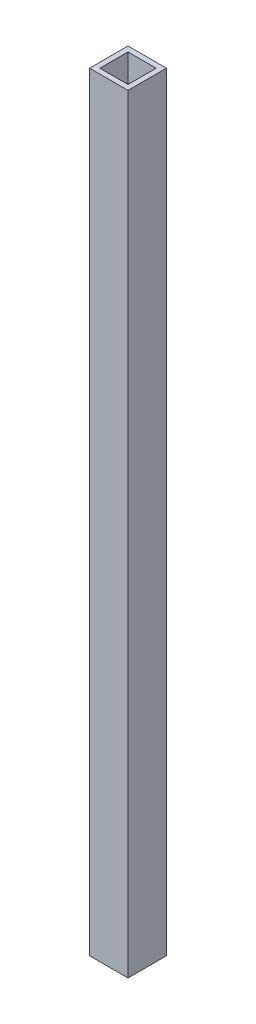
ISO-10303-21;
HEADER;
FILE_DESCRIPTION(('STEP AP214'),'2;1');
FILE_NAME('part.step','',(''),(''),'','','');
FILE_SCHEMA(('AUTOMOTIVE_DESIGN { 1 0 10303 214 1 1 1 1 }'));
ENDSEC;
DATA;
#1=APPLICATION_CONTEXT('core data for automotive mechanical design processes');
#2=APPLICATION_PROTOCOL_DEFINITION('international standard','automotive_design',2000,#1);
#3=PRODUCT_CONTEXT('',#1,'mechanical');
#4=PRODUCT('Part','Part','',(#3));
#5=PRODUCT_RELATED_PRODUCT_CATEGORY('part','',(#4));
#6=PRODUCT_DEFINITION_FORMATION('','',#4);
#7=PRODUCT_DEFINITION_CONTEXT('part definition',#1,'design');
#8=PRODUCT_DEFINITION('design','',#6,#7);
#9=PRODUCT_DEFINITION_SHAPE('','',#8);
#10=(LENGTH_UNIT() NAMED_UNIT(*) SI_UNIT(.MILLI.,.METRE.));
#11=(NAMED_UNIT(*) PLANE_ANGLE_UNIT() SI_UNIT($,.RADIAN.));
#12=(NAMED_UNIT(*) SI_UNIT($,.STERADIAN.) SOLID_ANGLE_UNIT());
#13=UNCERTAINTY_MEASURE_WITH_UNIT(LENGTH_MEASURE(1.E-05),#10,'distance_accuracy_value','');
#14=(GEOMETRIC_REPRESENTATION_CONTEXT(3) GLOBAL_UNCERTAINTY_ASSIGNED_CONTEXT((#13)) GLOBAL_UNIT_ASSIGNED_CONTEXT((#10,
#11,#12)) REPRESENTATION_CONTEXT('',''));
#15=CARTESIAN_POINT('',(0.,0.,0.));
#16=DIRECTION('',(0.,0.,1.));
#17=DIRECTION('',(1.,0.,0.));
#18=AXIS2_PLACEMENT_3D('',#15,#16,#17);
#19=CARTESIAN_POINT('',(0.,300.,0.));
#20=DIRECTION('',(0.,-1.,0.));
#21=DIRECTION('',(0.,0.,-1.));
#22=AXIS2_PLACEMENT_3D('',#19,#20,#21);
#23=PLANE('',#22);
#24=DIRECTION('',(0.,0.,1.));
#25=VECTOR('',#24,1.);
#26=CARTESIAN_POINT('',(0.,300.,0.));
#27=LINE('',#26,#25);
#28=CARTESIAN_POINT('',(0.,300.,-15.));
#29=VERTEX_POINT('',#28);
#30=CARTESIAN_POINT('',(0.,300.,0.));
#31=VERTEX_POINT('',#30);
#32=EDGE_CURVE('E156',#29,#31,#27,.T.);
#33=ORIENTED_EDGE('',*,*,#32,.T.);
#34=DIRECTION('',(1.,0.,0.));
#35=VECTOR('',#34,1.);
#36=CARTESIAN_POINT('',(0.,300.,0.));
#37=LINE('',#36,#35);
#38=CARTESIAN_POINT('',(15.,300.,0.));
#39=VERTEX_POINT('',#38);
#40=EDGE_CURVE('E160',#31,#39,#37,.T.);
#41=ORIENTED_EDGE('',*,*,#40,.T.);
#42=DIRECTION('',(0.,0.,-1.));
#43=VECTOR('',#42,1.);
#44=CARTESIAN_POINT('',(15.,300.,0.));
#45=LINE('',#44,#43);
#46=CARTESIAN_POINT('',(15.,300.,-15.));
#47=VERTEX_POINT('',#46);
#48=EDGE_CURVE('E164',#39,#47,#45,.T.);
#49=ORIENTED_EDGE('',*,*,#48,.T.);
#50=DIRECTION('',(-1.,0.,0.));
#51=VECTOR('',#50,1.);
#52=CARTESIAN_POINT('',(0.,300.,-15.));
#53=LINE('',#52,#51);
#54=EDGE_CURVE('E167',#47,#29,#53,.T.);
#55=ORIENTED_EDGE('',*,*,#54,.T.);
#56=EDGE_LOOP('',(#33,#41,#49,#55));
#57=FACE_BOUND('',#56,.T.);
#58=DIRECTION('',(1.,0.,0.));
#59=VECTOR('',#58,1.);
#60=CARTESIAN_POINT('',(2.,300.,-2.));
#61=LINE('',#60,#59);
#62=CARTESIAN_POINT('',(2.,300.,-2.));
#63=VERTEX_POINT('',#62);
#64=CARTESIAN_POINT('',(13.,300.,-2.));
#65=VERTEX_POINT('',#64);
#66=EDGE_CURVE('E108',#63,#65,#61,.T.);
#67=ORIENTED_EDGE('',*,*,#66,.F.);
#68=DIRECTION('',(0.,0.,1.));
#69=VECTOR('',#68,1.);
#70=CARTESIAN_POINT('',(2.,300.,-2.));
#71=LINE('',#70,#69);
#72=CARTESIAN_POINT('',(2.,300.,-13.));
#73=VERTEX_POINT('',#72);
#74=EDGE_CURVE('E134',#73,#63,#71,.T.);
#75=ORIENTED_EDGE('',*,*,#74,.F.);
#76=DIRECTION('',(-1.,0.,0.));
#77=VECTOR('',#76,1.);
#78=CARTESIAN_POINT('',(2.,300.,-13.));
#79=LINE('',#78,#77);
#80=CARTESIAN_POINT('',(13.,300.,-13.));
#81=VERTEX_POINT('',#80);
#82=EDGE_CURVE('E130',#81,#73,#79,.T.);
#83=ORIENTED_EDGE('',*,*,#82,.F.);
#84=DIRECTION('',(0.,0.,-1.));
#85=VECTOR('',#84,1.);
#86=CARTESIAN_POINT('',(13.,300.,-2.));
#87=LINE('',#86,#85);
#88=EDGE_CURVE('E117',#65,#81,#87,.T.);
#89=ORIENTED_EDGE('',*,*,#88,.F.);
#90=EDGE_LOOP('',(#67,#75,#83,#89));
#91=FACE_BOUND('',#90,.T.);
#92=ADVANCED_FACE('F42',(#57,#91),#23,.F.);
#93=CARTESIAN_POINT('',(0.,0.,0.));
#94=DIRECTION('',(0.,-1.,0.));
#95=DIRECTION('',(0.,0.,-1.));
#96=AXIS2_PLACEMENT_3D('',#93,#94,#95);
#97=PLANE('',#96);
#98=DIRECTION('',(0.,0.,1.));
#99=VECTOR('',#98,1.);
#100=CARTESIAN_POINT('',(0.,0.,0.));
#101=LINE('',#100,#99);
#102=CARTESIAN_POINT('',(0.,0.,-15.));
#103=VERTEX_POINT('',#102);
#104=CARTESIAN_POINT('',(0.,0.,0.));
#105=VERTEX_POINT('',#104);
#106=EDGE_CURVE('E126',#103,#105,#101,.T.);
#107=ORIENTED_EDGE('',*,*,#106,.F.);
#108=DIRECTION('',(-1.,0.,0.));
#109=VECTOR('',#108,1.);
#110=CARTESIAN_POINT('',(0.,0.,-15.));
#111=LINE('',#110,#109);
#112=CARTESIAN_POINT('',(15.,0.,-15.));
#113=VERTEX_POINT('',#112);
#114=EDGE_CURVE('E161',#113,#103,#111,.T.);
#115=ORIENTED_EDGE('',*,*,#114,.F.);
#116=DIRECTION('',(0.,0.,-1.));
#117=VECTOR('',#116,1.);
#118=CARTESIAN_POINT('',(15.,0.,0.));
#119=LINE('',#118,#117);
#120=CARTESIAN_POINT('',(15.,0.,0.));
#121=VERTEX_POINT('',#120);
#122=EDGE_CURVE('E177',#121,#113,#119,.T.);
#123=ORIENTED_EDGE('',*,*,#122,.F.);
#124=DIRECTION('',(1.,0.,0.));
#125=VECTOR('',#124,1.);
#126=CARTESIAN_POINT('',(0.,0.,0.));
#127=LINE('',#126,#125);
#128=EDGE_CURVE('E174',#105,#121,#127,.T.);
#129=ORIENTED_EDGE('',*,*,#128,.F.);
#130=EDGE_LOOP('',(#107,#115,#123,#129));
#131=FACE_BOUND('',#130,.T.);
#132=DIRECTION('',(0.,0.,1.));
#133=VECTOR('',#132,1.);
#134=CARTESIAN_POINT('',(2.,0.,-2.));
#135=LINE('',#134,#133);
#136=CARTESIAN_POINT('',(2.,0.,-13.));
#137=VERTEX_POINT('',#136);
#138=CARTESIAN_POINT('',(2.,0.,-2.));
#139=VERTEX_POINT('',#138);
#140=EDGE_CURVE('E118',#137,#139,#135,.T.);
#141=ORIENTED_EDGE('',*,*,#140,.T.);
#142=DIRECTION('',(1.,0.,0.));
#143=VECTOR('',#142,1.);
#144=CARTESIAN_POINT('',(2.,0.,-2.));
#145=LINE('',#144,#143);
#146=CARTESIAN_POINT('',(13.,0.,-2.));
#147=VERTEX_POINT('',#146);
#148=EDGE_CURVE('E66',#139,#147,#145,.T.);
#149=ORIENTED_EDGE('',*,*,#148,.T.);
#150=DIRECTION('',(0.,0.,-1.));
#151=VECTOR('',#150,1.);
#152=CARTESIAN_POINT('',(13.,0.,-2.));
#153=LINE('',#152,#151);
#154=CARTESIAN_POINT('',(13.,0.,-13.));
#155=VERTEX_POINT('',#154);
#156=EDGE_CURVE('E124',#147,#155,#153,.T.);
#157=ORIENTED_EDGE('',*,*,#156,.T.);
#158=DIRECTION('',(-1.,0.,0.));
#159=VECTOR('',#158,1.);
#160=CARTESIAN_POINT('',(2.,0.,-13.));
#161=LINE('',#160,#159);
#162=EDGE_CURVE('E143',#155,#137,#161,.T.);
#163=ORIENTED_EDGE('',*,*,#162,.T.);
#164=EDGE_LOOP('',(#141,#149,#157,#163));
#165=FACE_BOUND('',#164,.T.);
#166=ADVANCED_FACE('F200',(#131,#165),#97,.T.);
#167=CARTESIAN_POINT('',(0.,300.,0.));
#168=DIRECTION('',(1.,0.,0.));
#169=DIRECTION('',(0.,0.,-1.));
#170=AXIS2_PLACEMENT_3D('',#167,#168,#169);
#171=PLANE('',#170);
#172=ORIENTED_EDGE('',*,*,#106,.T.);
#173=DIRECTION('',(0.,-1.,0.));
#174=VECTOR('',#173,1.);
#175=CARTESIAN_POINT('',(0.,300.,0.));
#176=LINE('',#175,#174);
#177=EDGE_CURVE('E11',#31,#105,#176,.T.);
#178=ORIENTED_EDGE('',*,*,#177,.F.);
#179=ORIENTED_EDGE('',*,*,#32,.F.);
#180=DIRECTION('',(0.,-1.,0.));
#181=VECTOR('',#180,1.);
#182=CARTESIAN_POINT('',(0.,300.,-15.));
#183=LINE('',#182,#181);
#184=EDGE_CURVE('E170',#29,#103,#183,.T.);
#185=ORIENTED_EDGE('',*,*,#184,.T.);
#186=EDGE_LOOP('',(#172,#178,#179,#185));
#187=FACE_BOUND('',#186,.T.);
#188=ADVANCED_FACE('F44',(#187),#171,.F.);
#189=CARTESIAN_POINT('',(0.,300.,0.));
#190=DIRECTION('',(0.,0.,-1.));
#191=DIRECTION('',(-1.,0.,0.));
#192=AXIS2_PLACEMENT_3D('',#189,#190,#191);
#193=PLANE('',#192);
#194=ORIENTED_EDGE('',*,*,#128,.T.);
#195=DIRECTION('',(0.,-1.,0.));
#196=VECTOR('',#195,1.);
#197=CARTESIAN_POINT('',(15.,300.,0.));
#198=LINE('',#197,#196);
#199=EDGE_CURVE('E51',#39,#121,#198,.T.);
#200=ORIENTED_EDGE('',*,*,#199,.F.);
#201=ORIENTED_EDGE('',*,*,#40,.F.);
#202=ORIENTED_EDGE('',*,*,#177,.T.);
#203=EDGE_LOOP('',(#194,#200,#201,#202));
#204=FACE_BOUND('',#203,.T.);
#205=ADVANCED_FACE('F210',(#204),#193,.F.);
#206=CARTESIAN_POINT('',(15.,300.,0.));
#207=DIRECTION('',(-1.,0.,0.));
#208=DIRECTION('',(0.,0.,1.));
#209=AXIS2_PLACEMENT_3D('',#206,#207,#208);
#210=PLANE('',#209);
#211=ORIENTED_EDGE('',*,*,#122,.T.);
#212=DIRECTION('',(0.,-1.,0.));
#213=VECTOR('',#212,1.);
#214=CARTESIAN_POINT('',(15.,300.,-15.));
#215=LINE('',#214,#213);
#216=EDGE_CURVE('E185',#47,#113,#215,.T.);
#217=ORIENTED_EDGE('',*,*,#216,.F.);
#218=ORIENTED_EDGE('',*,*,#48,.F.);
#219=ORIENTED_EDGE('',*,*,#199,.T.);
#220=EDGE_LOOP('',(#211,#217,#218,#219));
#221=FACE_BOUND('',#220,.T.);
#222=ADVANCED_FACE('F194',(#221),#210,.F.);
#223=CARTESIAN_POINT('',(0.,300.,-15.));
#224=DIRECTION('',(0.,0.,1.));
#225=DIRECTION('',(1.,0.,0.));
#226=AXIS2_PLACEMENT_3D('',#223,#224,#225);
#227=PLANE('',#226);
#228=ORIENTED_EDGE('',*,*,#114,.T.);
#229=ORIENTED_EDGE('',*,*,#184,.F.);
#230=ORIENTED_EDGE('',*,*,#54,.F.);
#231=ORIENTED_EDGE('',*,*,#216,.T.);
#232=EDGE_LOOP('',(#228,#229,#230,#231));
#233=FACE_BOUND('',#232,.T.);
#234=ADVANCED_FACE('F204',(#233),#227,.F.);
#235=CARTESIAN_POINT('',(2.,300.,-2.));
#236=DIRECTION('',(0.,0.,-1.));
#237=DIRECTION('',(-1.,0.,0.));
#238=AXIS2_PLACEMENT_3D('',#235,#236,#237);
#239=PLANE('',#238);
#240=ORIENTED_EDGE('',*,*,#148,.F.);
#241=DIRECTION('',(0.,-1.,0.));
#242=VECTOR('',#241,1.);
#243=CARTESIAN_POINT('',(2.,300.,-2.));
#244=LINE('',#243,#242);
#245=EDGE_CURVE('E112',#63,#139,#244,.T.);
#246=ORIENTED_EDGE('',*,*,#245,.F.);
#247=ORIENTED_EDGE('',*,*,#66,.T.);
#248=DIRECTION('',(0.,-1.,0.));
#249=VECTOR('',#248,1.);
#250=CARTESIAN_POINT('',(13.,300.,-2.));
#251=LINE('',#250,#249);
#252=EDGE_CURVE('E111',#65,#147,#251,.T.);
#253=ORIENTED_EDGE('',*,*,#252,.T.);
#254=EDGE_LOOP('',(#240,#246,#247,#253));
#255=FACE_BOUND('',#254,.T.);
#256=ADVANCED_FACE('F110',(#255),#239,.T.);
#257=CARTESIAN_POINT('',(13.,300.,-2.));
#258=DIRECTION('',(-1.,0.,0.));
#259=DIRECTION('',(0.,0.,1.));
#260=AXIS2_PLACEMENT_3D('',#257,#258,#259);
#261=PLANE('',#260);
#262=ORIENTED_EDGE('',*,*,#156,.F.);
#263=ORIENTED_EDGE('',*,*,#252,.F.);
#264=ORIENTED_EDGE('',*,*,#88,.T.);
#265=DIRECTION('',(0.,-1.,0.));
#266=VECTOR('',#265,1.);
#267=CARTESIAN_POINT('',(13.,300.,-13.));
#268=LINE('',#267,#266);
#269=EDGE_CURVE('E127',#81,#155,#268,.T.);
#270=ORIENTED_EDGE('',*,*,#269,.T.);
#271=EDGE_LOOP('',(#262,#263,#264,#270));
#272=FACE_BOUND('',#271,.T.);
#273=ADVANCED_FACE('F121',(#272),#261,.T.);
#274=CARTESIAN_POINT('',(2.,300.,-13.));
#275=DIRECTION('',(0.,0.,1.));
#276=DIRECTION('',(1.,0.,0.));
#277=AXIS2_PLACEMENT_3D('',#274,#275,#276);
#278=PLANE('',#277);
#279=ORIENTED_EDGE('',*,*,#162,.F.);
#280=ORIENTED_EDGE('',*,*,#269,.F.);
#281=ORIENTED_EDGE('',*,*,#82,.T.);
#282=DIRECTION('',(0.,-1.,0.));
#283=VECTOR('',#282,1.);
#284=CARTESIAN_POINT('',(2.,300.,-13.));
#285=LINE('',#284,#283);
#286=EDGE_CURVE('E58',#73,#137,#285,.T.);
#287=ORIENTED_EDGE('',*,*,#286,.T.);
#288=EDGE_LOOP('',(#279,#280,#281,#287));
#289=FACE_BOUND('',#288,.T.);
#290=ADVANCED_FACE('F233',(#289),#278,.T.);
#291=CARTESIAN_POINT('',(2.,300.,-2.));
#292=DIRECTION('',(1.,0.,0.));
#293=DIRECTION('',(0.,0.,-1.));
#294=AXIS2_PLACEMENT_3D('',#291,#292,#293);
#295=PLANE('',#294);
#296=ORIENTED_EDGE('',*,*,#140,.F.);
#297=ORIENTED_EDGE('',*,*,#286,.F.);
#298=ORIENTED_EDGE('',*,*,#74,.T.);
#299=ORIENTED_EDGE('',*,*,#245,.T.);
#300=EDGE_LOOP('',(#296,#297,#298,#299));
#301=FACE_BOUND('',#300,.T.);
#302=ADVANCED_FACE('F237',(#301),#295,.T.);
#303=CLOSED_SHELL('',(#92,#166,#188,#205,#222,#234,#256,#273,#290,#302));
#304=MANIFOLD_SOLID_BREP('B2',#303);
#305=ADVANCED_BREP_SHAPE_REPRESENTATION('',(#18,#304),#14);
#306=SHAPE_DEFINITION_REPRESENTATION(#9,#305);
ENDSEC;
END-ISO-10303-21;
